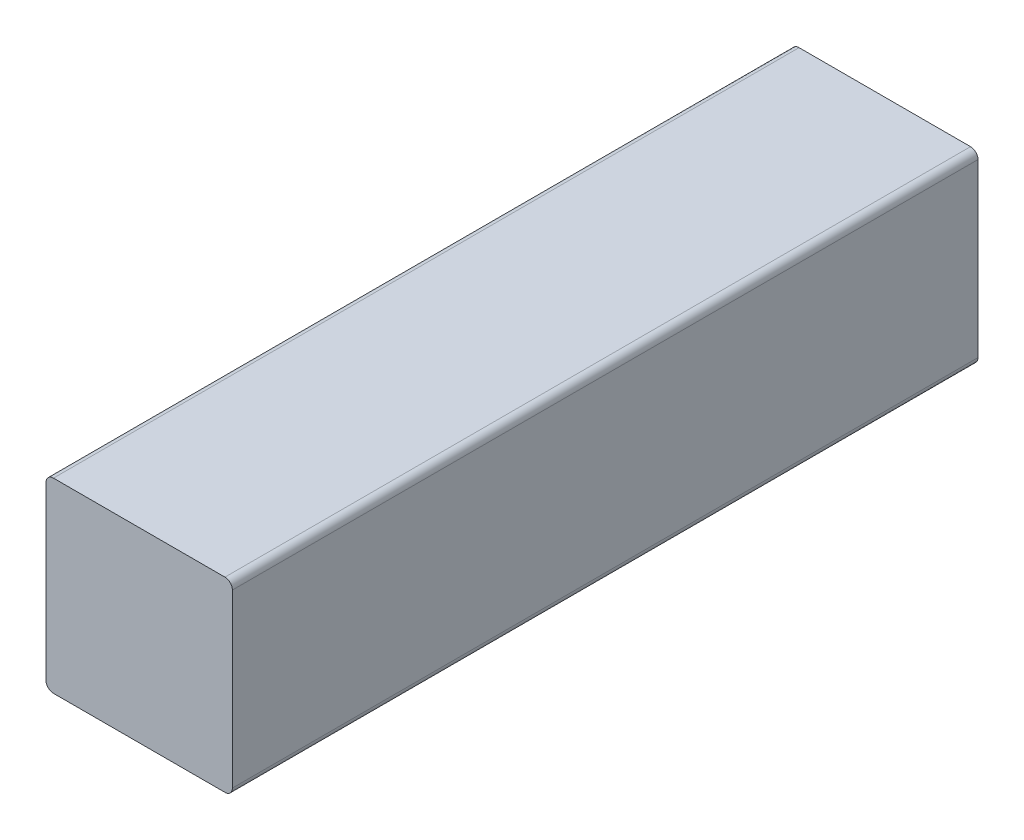
ISO-10303-21;
HEADER;
FILE_DESCRIPTION(('STEP AP214'),'2;1');
FILE_NAME('part.step','',(''),(''),'','','');
FILE_SCHEMA(('AUTOMOTIVE_DESIGN { 1 0 10303 214 1 1 1 1 }'));
ENDSEC;
DATA;
#1=APPLICATION_CONTEXT('core data for automotive mechanical design processes');
#2=APPLICATION_PROTOCOL_DEFINITION('international standard','automotive_design',2000,#1);
#3=PRODUCT_CONTEXT('',#1,'mechanical');
#4=PRODUCT('Part','Part','',(#3));
#5=PRODUCT_RELATED_PRODUCT_CATEGORY('part','',(#4));
#6=PRODUCT_DEFINITION_FORMATION('','',#4);
#7=PRODUCT_DEFINITION_CONTEXT('part definition',#1,'design');
#8=PRODUCT_DEFINITION('design','',#6,#7);
#9=PRODUCT_DEFINITION_SHAPE('','',#8);
#10=(LENGTH_UNIT() NAMED_UNIT(*) SI_UNIT(.MILLI.,.METRE.));
#11=(NAMED_UNIT(*) PLANE_ANGLE_UNIT() SI_UNIT($,.RADIAN.));
#12=(NAMED_UNIT(*) SI_UNIT($,.STERADIAN.) SOLID_ANGLE_UNIT());
#13=UNCERTAINTY_MEASURE_WITH_UNIT(LENGTH_MEASURE(1.E-05),#10,'distance_accuracy_value','');
#14=(GEOMETRIC_REPRESENTATION_CONTEXT(3) GLOBAL_UNCERTAINTY_ASSIGNED_CONTEXT((#13)) GLOBAL_UNIT_ASSIGNED_CONTEXT((#10,
#11,#12)) REPRESENTATION_CONTEXT('',''));
#15=CARTESIAN_POINT('',(0.,0.,0.));
#16=DIRECTION('',(0.,0.,1.));
#17=DIRECTION('',(1.,0.,0.));
#18=AXIS2_PLACEMENT_3D('',#15,#16,#17);
#19=CARTESIAN_POINT('',(0.,0.,-25.4));
#20=DIRECTION('',(-1.,0.,0.));
#21=DIRECTION('',(0.,-1.,0.));
#22=AXIS2_PLACEMENT_3D('',#19,#20,#21);
#23=PLANE('',#22);
#24=DIRECTION('',(0.,-1.,0.));
#25=VECTOR('',#24,1.);
#26=CARTESIAN_POINT('',(0.,0.,-25.4));
#27=LINE('',#26,#25);
#28=CARTESIAN_POINT('',(0.,6.096,-25.4));
#29=VERTEX_POINT('',#28);
#30=CARTESIAN_POINT('',(0.,0.254,-25.4));
#31=VERTEX_POINT('',#30);
#32=EDGE_CURVE('E162',#29,#31,#27,.T.);
#33=ORIENTED_EDGE('',*,*,#32,.T.);
#34=DIRECTION('',(0.,0.,1.));
#35=VECTOR('',#34,1.);
#36=CARTESIAN_POINT('',(0.,0.254,-25.4));
#37=LINE('',#36,#35);
#38=CARTESIAN_POINT('',(0.,0.254,0.));
#39=VERTEX_POINT('',#38);
#40=EDGE_CURVE('E110',#31,#39,#37,.T.);
#41=ORIENTED_EDGE('',*,*,#40,.T.);
#42=DIRECTION('',(0.,-1.,0.));
#43=VECTOR('',#42,1.);
#44=CARTESIAN_POINT('',(0.,0.,0.));
#45=LINE('',#44,#43);
#46=CARTESIAN_POINT('',(0.,6.096,0.));
#47=VERTEX_POINT('',#46);
#48=EDGE_CURVE('E102',#47,#39,#45,.T.);
#49=ORIENTED_EDGE('',*,*,#48,.F.);
#50=DIRECTION('',(0.,0.,1.));
#51=VECTOR('',#50,1.);
#52=CARTESIAN_POINT('',(0.,6.096,-25.4));
#53=LINE('',#52,#51);
#54=EDGE_CURVE('E115',#47,#29,#53,.F.);
#55=ORIENTED_EDGE('',*,*,#54,.T.);
#56=EDGE_LOOP('',(#33,#41,#49,#55));
#57=FACE_BOUND('',#56,.T.);
#58=ADVANCED_FACE('F33',(#57),#23,.T.);
#59=CARTESIAN_POINT('',(0.,6.35,-25.4));
#60=DIRECTION('',(0.,1.,0.));
#61=DIRECTION('',(0.,0.,1.));
#62=AXIS2_PLACEMENT_3D('',#59,#60,#61);
#63=PLANE('',#62);
#64=DIRECTION('',(-1.,0.,0.));
#65=VECTOR('',#64,1.);
#66=CARTESIAN_POINT('',(0.,6.35,0.));
#67=LINE('',#66,#65);
#68=CARTESIAN_POINT('',(6.096,6.35,0.));
#69=VERTEX_POINT('',#68);
#70=CARTESIAN_POINT('',(0.253999999999999,6.35,0.));
#71=VERTEX_POINT('',#70);
#72=EDGE_CURVE('E104',#69,#71,#67,.T.);
#73=ORIENTED_EDGE('',*,*,#72,.F.);
#74=DIRECTION('',(0.,0.,1.));
#75=VECTOR('',#74,1.);
#76=CARTESIAN_POINT('',(6.096,6.35,-25.4));
#77=LINE('',#76,#75);
#78=CARTESIAN_POINT('',(6.096,6.35,-25.4));
#79=VERTEX_POINT('',#78);
#80=EDGE_CURVE('E11',#69,#79,#77,.F.);
#81=ORIENTED_EDGE('',*,*,#80,.T.);
#82=DIRECTION('',(-1.,0.,0.));
#83=VECTOR('',#82,1.);
#84=CARTESIAN_POINT('',(0.,6.35,-25.4));
#85=LINE('',#84,#83);
#86=CARTESIAN_POINT('',(0.253999999999999,6.35,-25.4));
#87=VERTEX_POINT('',#86);
#88=EDGE_CURVE('E122',#79,#87,#85,.T.);
#89=ORIENTED_EDGE('',*,*,#88,.T.);
#90=DIRECTION('',(0.,0.,1.));
#91=VECTOR('',#90,1.);
#92=CARTESIAN_POINT('',(0.253999999999999,6.35,-25.4));
#93=LINE('',#92,#91);
#94=EDGE_CURVE('E41',#87,#71,#93,.T.);
#95=ORIENTED_EDGE('',*,*,#94,.T.);
#96=EDGE_LOOP('',(#73,#81,#89,#95));
#97=FACE_BOUND('',#96,.T.);
#98=ADVANCED_FACE('F151',(#97),#63,.T.);
#99=CARTESIAN_POINT('',(6.35,0.,-25.4));
#100=DIRECTION('',(1.,0.,0.));
#101=DIRECTION('',(0.,1.,0.));
#102=AXIS2_PLACEMENT_3D('',#99,#100,#101);
#103=PLANE('',#102);
#104=DIRECTION('',(0.,1.,0.));
#105=VECTOR('',#104,1.);
#106=CARTESIAN_POINT('',(6.35,0.,0.));
#107=LINE('',#106,#105);
#108=CARTESIAN_POINT('',(6.35,0.254,0.));
#109=VERTEX_POINT('',#108);
#110=CARTESIAN_POINT('',(6.35,6.096,0.));
#111=VERTEX_POINT('',#110);
#112=EDGE_CURVE('E160',#109,#111,#107,.T.);
#113=ORIENTED_EDGE('',*,*,#112,.F.);
#114=DIRECTION('',(0.,0.,1.));
#115=VECTOR('',#114,1.);
#116=CARTESIAN_POINT('',(6.35,0.254,-25.4));
#117=LINE('',#116,#115);
#118=CARTESIAN_POINT('',(6.35,0.254,-25.4));
#119=VERTEX_POINT('',#118);
#120=EDGE_CURVE('E55',#109,#119,#117,.F.);
#121=ORIENTED_EDGE('',*,*,#120,.T.);
#122=DIRECTION('',(0.,1.,0.));
#123=VECTOR('',#122,1.);
#124=CARTESIAN_POINT('',(6.35,0.,-25.4));
#125=LINE('',#124,#123);
#126=CARTESIAN_POINT('',(6.35,6.096,-25.4));
#127=VERTEX_POINT('',#126);
#128=EDGE_CURVE('E126',#119,#127,#125,.T.);
#129=ORIENTED_EDGE('',*,*,#128,.T.);
#130=DIRECTION('',(0.,0.,1.));
#131=VECTOR('',#130,1.);
#132=CARTESIAN_POINT('',(6.35,6.096,-25.4));
#133=LINE('',#132,#131);
#134=EDGE_CURVE('E147',#127,#111,#133,.T.);
#135=ORIENTED_EDGE('',*,*,#134,.T.);
#136=EDGE_LOOP('',(#113,#121,#129,#135));
#137=FACE_BOUND('',#136,.T.);
#138=ADVANCED_FACE('F159',(#137),#103,.T.);
#139=CARTESIAN_POINT('',(0.,0.,-25.4));
#140=DIRECTION('',(0.,-1.,0.));
#141=DIRECTION('',(0.,0.,-1.));
#142=AXIS2_PLACEMENT_3D('',#139,#140,#141);
#143=PLANE('',#142);
#144=DIRECTION('',(1.,0.,0.));
#145=VECTOR('',#144,1.);
#146=CARTESIAN_POINT('',(0.,0.,0.));
#147=LINE('',#146,#145);
#148=CARTESIAN_POINT('',(0.254,0.,0.));
#149=VERTEX_POINT('',#148);
#150=CARTESIAN_POINT('',(6.096,0.,0.));
#151=VERTEX_POINT('',#150);
#152=EDGE_CURVE('E118',#149,#151,#147,.T.);
#153=ORIENTED_EDGE('',*,*,#152,.F.);
#154=DIRECTION('',(0.,0.,1.));
#155=VECTOR('',#154,1.);
#156=CARTESIAN_POINT('',(0.254,0.,-25.4));
#157=LINE('',#156,#155);
#158=CARTESIAN_POINT('',(0.254,0.,-25.4));
#159=VERTEX_POINT('',#158);
#160=EDGE_CURVE('E139',#149,#159,#157,.F.);
#161=ORIENTED_EDGE('',*,*,#160,.T.);
#162=DIRECTION('',(1.,0.,0.));
#163=VECTOR('',#162,1.);
#164=CARTESIAN_POINT('',(0.,0.,-25.4));
#165=LINE('',#164,#163);
#166=CARTESIAN_POINT('',(6.096,0.,-25.4));
#167=VERTEX_POINT('',#166);
#168=EDGE_CURVE('E166',#159,#167,#165,.T.);
#169=ORIENTED_EDGE('',*,*,#168,.T.);
#170=DIRECTION('',(0.,0.,1.));
#171=VECTOR('',#170,1.);
#172=CARTESIAN_POINT('',(6.096,0.,-25.4));
#173=LINE('',#172,#171);
#174=EDGE_CURVE('E136',#167,#151,#173,.T.);
#175=ORIENTED_EDGE('',*,*,#174,.T.);
#176=EDGE_LOOP('',(#153,#161,#169,#175));
#177=FACE_BOUND('',#176,.T.);
#178=ADVANCED_FACE('F175',(#177),#143,.T.);
#179=CARTESIAN_POINT('',(0.,0.,-25.4));
#180=DIRECTION('',(0.,0.,-1.));
#181=DIRECTION('',(-1.,0.,0.));
#182=AXIS2_PLACEMENT_3D('',#179,#180,#181);
#183=PLANE('',#182);
#184=ORIENTED_EDGE('',*,*,#168,.F.);
#185=CARTESIAN_POINT('',(0.254,0.254,-25.4));
#186=DIRECTION('',(0.,0.,-1.));
#187=DIRECTION('',(-1.,0.,0.));
#188=AXIS2_PLACEMENT_3D('',#185,#186,#187);
#189=CIRCLE('',#188,0.254);
#190=EDGE_CURVE('E145',#159,#31,#189,.T.);
#191=ORIENTED_EDGE('',*,*,#190,.T.);
#192=ORIENTED_EDGE('',*,*,#32,.F.);
#193=CARTESIAN_POINT('',(0.253999999999999,6.096,-25.4));
#194=DIRECTION('',(0.,0.,-1.));
#195=DIRECTION('',(-1.,0.,0.));
#196=AXIS2_PLACEMENT_3D('',#193,#194,#195);
#197=CIRCLE('',#196,0.254);
#198=EDGE_CURVE('E121',#29,#87,#197,.T.);
#199=ORIENTED_EDGE('',*,*,#198,.T.);
#200=ORIENTED_EDGE('',*,*,#88,.F.);
#201=CARTESIAN_POINT('',(6.096,6.096,-25.4));
#202=DIRECTION('',(0.,0.,-1.));
#203=DIRECTION('',(-1.,0.,0.));
#204=AXIS2_PLACEMENT_3D('',#201,#202,#203);
#205=CIRCLE('',#204,0.254);
#206=EDGE_CURVE('E48',#79,#127,#205,.T.);
#207=ORIENTED_EDGE('',*,*,#206,.T.);
#208=ORIENTED_EDGE('',*,*,#128,.F.);
#209=CARTESIAN_POINT('',(6.096,0.254,-25.4));
#210=DIRECTION('',(0.,0.,-1.));
#211=DIRECTION('',(-1.,0.,0.));
#212=AXIS2_PLACEMENT_3D('',#209,#210,#211);
#213=CIRCLE('',#212,0.254);
#214=EDGE_CURVE('E143',#119,#167,#213,.T.);
#215=ORIENTED_EDGE('',*,*,#214,.T.);
#216=EDGE_LOOP('',(#184,#191,#192,#199,#200,#207,#208,#215));
#217=FACE_BOUND('',#216,.T.);
#218=ADVANCED_FACE('F154',(#217),#183,.T.);
#219=CARTESIAN_POINT('',(0.,0.,0.));
#220=DIRECTION('',(0.,0.,-1.));
#221=DIRECTION('',(-1.,0.,0.));
#222=AXIS2_PLACEMENT_3D('',#219,#220,#221);
#223=PLANE('',#222);
#224=ORIENTED_EDGE('',*,*,#48,.T.);
#225=CARTESIAN_POINT('',(0.254,0.254,0.));
#226=DIRECTION('',(0.,0.,-1.));
#227=DIRECTION('',(-1.,0.,0.));
#228=AXIS2_PLACEMENT_3D('',#225,#226,#227);
#229=CIRCLE('',#228,0.254);
#230=EDGE_CURVE('E134',#39,#149,#229,.F.);
#231=ORIENTED_EDGE('',*,*,#230,.T.);
#232=ORIENTED_EDGE('',*,*,#152,.T.);
#233=CARTESIAN_POINT('',(6.096,0.254,0.));
#234=DIRECTION('',(0.,0.,-1.));
#235=DIRECTION('',(-1.,0.,0.));
#236=AXIS2_PLACEMENT_3D('',#233,#234,#235);
#237=CIRCLE('',#236,0.254);
#238=EDGE_CURVE('E132',#151,#109,#237,.F.);
#239=ORIENTED_EDGE('',*,*,#238,.T.);
#240=ORIENTED_EDGE('',*,*,#112,.T.);
#241=CARTESIAN_POINT('',(6.096,6.096,0.));
#242=DIRECTION('',(0.,0.,-1.));
#243=DIRECTION('',(-1.,0.,0.));
#244=AXIS2_PLACEMENT_3D('',#241,#242,#243);
#245=CIRCLE('',#244,0.254);
#246=EDGE_CURVE('E109',#111,#69,#245,.F.);
#247=ORIENTED_EDGE('',*,*,#246,.T.);
#248=ORIENTED_EDGE('',*,*,#72,.T.);
#249=CARTESIAN_POINT('',(0.253999999999999,6.096,0.));
#250=DIRECTION('',(0.,0.,-1.));
#251=DIRECTION('',(-1.,0.,0.));
#252=AXIS2_PLACEMENT_3D('',#249,#250,#251);
#253=CIRCLE('',#252,0.254);
#254=EDGE_CURVE('E99',#71,#47,#253,.F.);
#255=ORIENTED_EDGE('',*,*,#254,.T.);
#256=EDGE_LOOP('',(#224,#231,#232,#239,#240,#247,#248,#255));
#257=FACE_BOUND('',#256,.T.);
#258=ADVANCED_FACE('F101',(#257),#223,.F.);
#259=CARTESIAN_POINT('',(0.254,0.254,-25.4));
#260=DIRECTION('',(0.,0.,1.));
#261=DIRECTION('',(1.,0.,0.));
#262=AXIS2_PLACEMENT_3D('',#259,#260,#261);
#263=CYLINDRICAL_SURFACE('',#262,0.254);
#264=ORIENTED_EDGE('',*,*,#190,.F.);
#265=ORIENTED_EDGE('',*,*,#160,.F.);
#266=ORIENTED_EDGE('',*,*,#230,.F.);
#267=ORIENTED_EDGE('',*,*,#40,.F.);
#268=EDGE_LOOP('',(#264,#265,#266,#267));
#269=FACE_BOUND('',#268,.T.);
#270=ADVANCED_FACE('F171',(#269),#263,.T.);
#271=CARTESIAN_POINT('',(6.096,0.254,-25.4));
#272=DIRECTION('',(0.,0.,1.));
#273=DIRECTION('',(1.,0.,0.));
#274=AXIS2_PLACEMENT_3D('',#271,#272,#273);
#275=CYLINDRICAL_SURFACE('',#274,0.254);
#276=ORIENTED_EDGE('',*,*,#214,.F.);
#277=ORIENTED_EDGE('',*,*,#120,.F.);
#278=ORIENTED_EDGE('',*,*,#238,.F.);
#279=ORIENTED_EDGE('',*,*,#174,.F.);
#280=EDGE_LOOP('',(#276,#277,#278,#279));
#281=FACE_BOUND('',#280,.T.);
#282=ADVANCED_FACE('F179',(#281),#275,.T.);
#283=CARTESIAN_POINT('',(6.096,6.096,-25.4));
#284=DIRECTION('',(0.,0.,1.));
#285=DIRECTION('',(1.,0.,0.));
#286=AXIS2_PLACEMENT_3D('',#283,#284,#285);
#287=CYLINDRICAL_SURFACE('',#286,0.254);
#288=ORIENTED_EDGE('',*,*,#206,.F.);
#289=ORIENTED_EDGE('',*,*,#80,.F.);
#290=ORIENTED_EDGE('',*,*,#246,.F.);
#291=ORIENTED_EDGE('',*,*,#134,.F.);
#292=EDGE_LOOP('',(#288,#289,#290,#291));
#293=FACE_BOUND('',#292,.T.);
#294=ADVANCED_FACE('F157',(#293),#287,.T.);
#295=CARTESIAN_POINT('',(0.253999999999999,6.096,-25.4));
#296=DIRECTION('',(0.,0.,1.));
#297=DIRECTION('',(1.,0.,0.));
#298=AXIS2_PLACEMENT_3D('',#295,#296,#297);
#299=CYLINDRICAL_SURFACE('',#298,0.254);
#300=ORIENTED_EDGE('',*,*,#198,.F.);
#301=ORIENTED_EDGE('',*,*,#54,.F.);
#302=ORIENTED_EDGE('',*,*,#254,.F.);
#303=ORIENTED_EDGE('',*,*,#94,.F.);
#304=EDGE_LOOP('',(#300,#301,#302,#303));
#305=FACE_BOUND('',#304,.T.);
#306=ADVANCED_FACE('F35',(#305),#299,.T.);
#307=CLOSED_SHELL('',(#58,#98,#138,#178,#218,#258,#270,#282,#294,#306));
#308=MANIFOLD_SOLID_BREP('B2',#307);
#309=ADVANCED_BREP_SHAPE_REPRESENTATION('',(#18,#308),#14);
#310=SHAPE_DEFINITION_REPRESENTATION(#9,#309);
ENDSEC;
END-ISO-10303-21;
